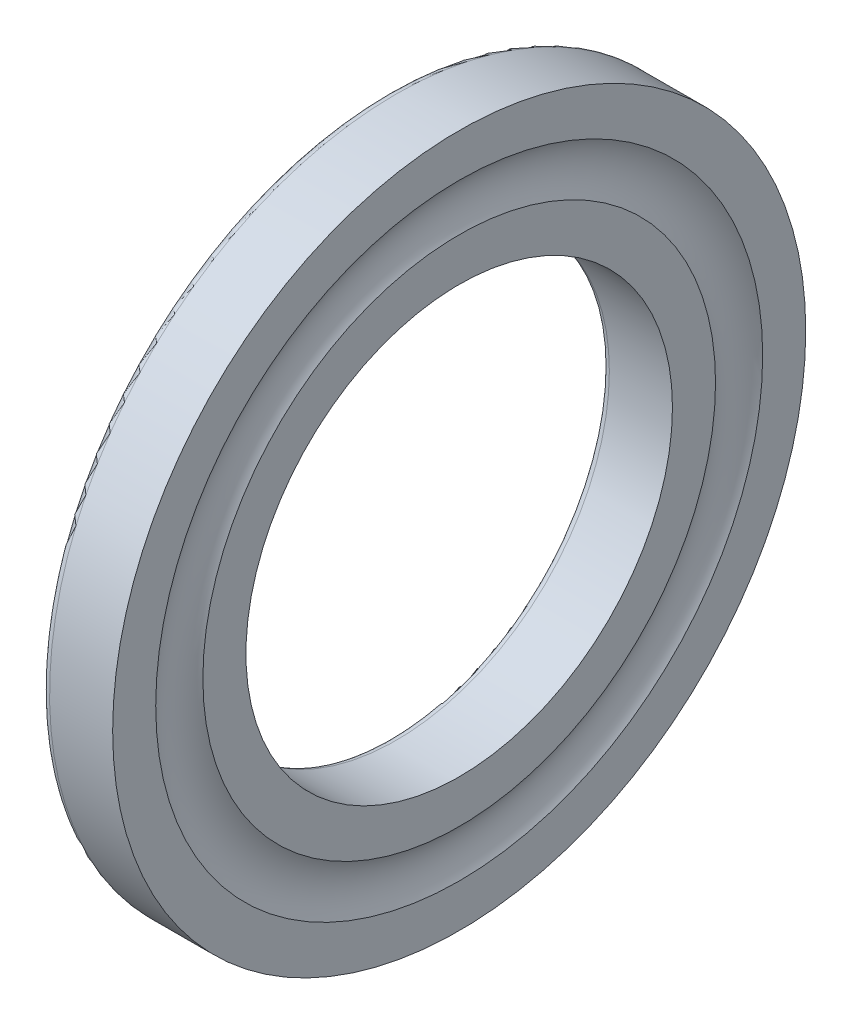
ISO-10303-21;
HEADER;
FILE_DESCRIPTION(('STEP AP214'),'2;1');
FILE_NAME('part.step','',(''),(''),'','','');
FILE_SCHEMA(('AUTOMOTIVE_DESIGN { 1 0 10303 214 1 1 1 1 }'));
ENDSEC;
DATA;
#1=APPLICATION_CONTEXT('core data for automotive mechanical design processes');
#2=APPLICATION_PROTOCOL_DEFINITION('international standard','automotive_design',2000,#1);
#3=PRODUCT_CONTEXT('',#1,'mechanical');
#4=PRODUCT('Part','Part','',(#3));
#5=PRODUCT_RELATED_PRODUCT_CATEGORY('part','',(#4));
#6=PRODUCT_DEFINITION_FORMATION('','',#4);
#7=PRODUCT_DEFINITION_CONTEXT('part definition',#1,'design');
#8=PRODUCT_DEFINITION('design','',#6,#7);
#9=PRODUCT_DEFINITION_SHAPE('','',#8);
#10=(LENGTH_UNIT() NAMED_UNIT(*) SI_UNIT(.MILLI.,.METRE.));
#11=(NAMED_UNIT(*) PLANE_ANGLE_UNIT() SI_UNIT($,.RADIAN.));
#12=(NAMED_UNIT(*) SI_UNIT($,.STERADIAN.) SOLID_ANGLE_UNIT());
#13=UNCERTAINTY_MEASURE_WITH_UNIT(LENGTH_MEASURE(1.E-05),#10,'distance_accuracy_value','');
#14=(GEOMETRIC_REPRESENTATION_CONTEXT(3) GLOBAL_UNCERTAINTY_ASSIGNED_CONTEXT((#13)) GLOBAL_UNIT_ASSIGNED_CONTEXT((#10,
#11,#12)) REPRESENTATION_CONTEXT('',''));
#15=CARTESIAN_POINT('',(0.,0.,0.));
#16=DIRECTION('',(0.,0.,1.));
#17=DIRECTION('',(1.,0.,0.));
#18=AXIS2_PLACEMENT_3D('',#15,#16,#17);
#19=CARTESIAN_POINT('',(8.,0.,0.));
#20=DIRECTION('',(1.,0.,0.));
#21=DIRECTION('',(0.,1.,0.));
#22=AXIS2_PLACEMENT_3D('',#19,#20,#21);
#23=TOROIDAL_SURFACE('',#22,21.,3.2);
#24=CARTESIAN_POINT('',(5.33333333333333,0.,0.));
#25=DIRECTION('',(1.,0.,0.));
#26=DIRECTION('',(0.,0.,-1.));
#27=AXIS2_PLACEMENT_3D('',#24,#25,#26);
#28=CIRCLE('',#27,22.7688665548562);
#29=CARTESIAN_POINT('',(5.33333333333333,0.,-22.7688665548562));
#30=VERTEX_POINT('',#29);
#31=EDGE_CURVE('E18',#30,#30,#28,.F.);
#32=ORIENTED_EDGE('',*,*,#31,.F.);
#33=EDGE_LOOP('',(#32));
#34=FACE_BOUND('',#33,.T.);
#35=CARTESIAN_POINT('',(5.33333333333334,0.,0.));
#36=DIRECTION('',(1.,0.,0.));
#37=DIRECTION('',(0.,0.,-1.));
#38=AXIS2_PLACEMENT_3D('',#35,#36,#37);
#39=CIRCLE('',#38,19.2311334451438);
#40=CARTESIAN_POINT('',(5.33333333333334,0.,-19.2311334451438));
#41=VERTEX_POINT('',#40);
#42=EDGE_CURVE('E52',#41,#41,#39,.T.);
#43=ORIENTED_EDGE('',*,*,#42,.F.);
#44=EDGE_LOOP('',(#43));
#45=FACE_BOUND('',#44,.T.);
#46=ADVANCED_FACE('F14',(#34,#45),#23,.F.);
#47=CARTESIAN_POINT('',(5.33333333333334,0.,21.));
#48=DIRECTION('',(1.,0.,0.));
#49=DIRECTION('',(0.,0.,-1.));
#50=AXIS2_PLACEMENT_3D('',#47,#48,#49);
#51=PLANE('',#50);
#52=CARTESIAN_POINT('',(5.33333333333334,0.,0.));
#53=DIRECTION('',(1.,0.,0.));
#54=DIRECTION('',(0.,0.,-1.));
#55=AXIS2_PLACEMENT_3D('',#52,#53,#54);
#56=CIRCLE('',#55,25.99999999995);
#57=CARTESIAN_POINT('',(5.33333333333334,0.,-25.99999999995));
#58=VERTEX_POINT('',#57);
#59=EDGE_CURVE('E50',#58,#58,#56,.F.);
#60=ORIENTED_EDGE('',*,*,#59,.F.);
#61=EDGE_LOOP('',(#60));
#62=FACE_BOUND('',#61,.T.);
#63=ORIENTED_EDGE('',*,*,#31,.T.);
#64=EDGE_LOOP('',(#63));
#65=FACE_BOUND('',#64,.T.);
#66=ADVANCED_FACE('F59',(#62,#65),#51,.T.);
#67=CARTESIAN_POINT('',(5.33333333333334,0.,21.));
#68=DIRECTION('',(1.,0.,0.));
#69=DIRECTION('',(0.,0.,-1.));
#70=AXIS2_PLACEMENT_3D('',#67,#68,#69);
#71=PLANE('',#70);
#72=CARTESIAN_POINT('',(5.33333333333334,0.,0.));
#73=DIRECTION('',(1.,0.,0.));
#74=DIRECTION('',(0.,0.,-1.));
#75=AXIS2_PLACEMENT_3D('',#72,#73,#74);
#76=CIRCLE('',#75,16.);
#77=CARTESIAN_POINT('',(5.33333333333334,0.,-16.));
#78=VERTEX_POINT('',#77);
#79=EDGE_CURVE('E37',#78,#78,#76,.T.);
#80=ORIENTED_EDGE('',*,*,#79,.F.);
#81=EDGE_LOOP('',(#80));
#82=FACE_BOUND('',#81,.T.);
#83=ORIENTED_EDGE('',*,*,#42,.T.);
#84=EDGE_LOOP('',(#83));
#85=FACE_BOUND('',#84,.T.);
#86=ADVANCED_FACE('F67',(#82,#85),#71,.T.);
#87=CARTESIAN_POINT('',(2.96666666666667,0.,0.));
#88=DIRECTION('',(1.,0.,0.));
#89=DIRECTION('',(0.,0.,-1.));
#90=AXIS2_PLACEMENT_3D('',#87,#88,#89);
#91=CYLINDRICAL_SURFACE('',#90,25.99999999995);
#92=ORIENTED_EDGE('',*,*,#59,.T.);
#93=EDGE_LOOP('',(#92));
#94=FACE_BOUND('',#93,.T.);
#95=CARTESIAN_POINT('',(0.600000000170714,0.,0.));
#96=DIRECTION('',(1.,0.,0.));
#97=DIRECTION('',(0.,1.,0.));
#98=AXIS2_PLACEMENT_3D('',#95,#96,#97);
#99=CIRCLE('',#98,25.9999999999);
#100=CARTESIAN_POINT('',(0.600000000170714,25.9999999999,0.));
#101=VERTEX_POINT('',#100);
#102=EDGE_CURVE('E32',#101,#101,#99,.F.);
#103=ORIENTED_EDGE('',*,*,#102,.F.);
#104=EDGE_LOOP('',(#103));
#105=FACE_BOUND('',#104,.T.);
#106=ADVANCED_FACE('F113',(#94,#105),#91,.T.);
#107=CARTESIAN_POINT('',(0.600000000000003,0.,0.));
#108=DIRECTION('',(1.,0.,0.));
#109=DIRECTION('',(0.,0.,-1.));
#110=AXIS2_PLACEMENT_3D('',#107,#108,#109);
#111=CYLINDRICAL_SURFACE('',#110,16.);
#112=CARTESIAN_POINT('',(0.600000000000003,0.,0.));
#113=DIRECTION('',(1.,0.,0.));
#114=DIRECTION('',(0.,1.,0.));
#115=AXIS2_PLACEMENT_3D('',#112,#113,#114);
#116=CIRCLE('',#115,16.);
#117=CARTESIAN_POINT('',(0.600000000000003,16.,0.));
#118=VERTEX_POINT('',#117);
#119=EDGE_CURVE('E27',#118,#118,#116,.T.);
#120=ORIENTED_EDGE('',*,*,#119,.F.);
#121=EDGE_LOOP('',(#120));
#122=FACE_BOUND('',#121,.T.);
#123=ORIENTED_EDGE('',*,*,#79,.T.);
#124=EDGE_LOOP('',(#123));
#125=FACE_BOUND('',#124,.T.);
#126=ADVANCED_FACE('F109',(#122,#125),#111,.F.);
#127=CARTESIAN_POINT('',(0.600000000170714,0.,0.));
#128=DIRECTION('',(1.,0.,0.));
#129=DIRECTION('',(0.,1.,0.));
#130=AXIS2_PLACEMENT_3D('',#127,#128,#129);
#131=TOROIDAL_SURFACE('',#130,25.3999999997293,0.600000000170713);
#132=CARTESIAN_POINT('',(0.,0.,0.));
#133=DIRECTION('',(1.,0.,0.));
#134=DIRECTION('',(0.,0.,1.));
#135=AXIS2_PLACEMENT_3D('',#132,#133,#134);
#136=CIRCLE('',#135,25.4);
#137=CARTESIAN_POINT('',(0.,0.,25.4));
#138=VERTEX_POINT('',#137);
#139=EDGE_CURVE('E22',#138,#138,#136,.F.);
#140=ORIENTED_EDGE('',*,*,#139,.F.);
#141=EDGE_LOOP('',(#140));
#142=FACE_BOUND('',#141,.T.);
#143=ORIENTED_EDGE('',*,*,#102,.T.);
#144=EDGE_LOOP('',(#143));
#145=FACE_BOUND('',#144,.T.);
#146=ADVANCED_FACE('F76',(#142,#145),#131,.T.);
#147=CARTESIAN_POINT('',(0.600000000270703,0.,0.));
#148=DIRECTION('',(1.,0.,0.));
#149=DIRECTION('',(0.,1.,0.));
#150=AXIS2_PLACEMENT_3D('',#147,#148,#149);
#151=TOROIDAL_SURFACE('',#150,16.6000000001707,0.600000000170705);
#152=ORIENTED_EDGE('',*,*,#119,.T.);
#153=EDGE_LOOP('',(#152));
#154=FACE_BOUND('',#153,.T.);
#155=CARTESIAN_POINT('',(9.99988937142038E-11,0.,0.));
#156=DIRECTION('',(-1.,0.,0.));
#157=DIRECTION('',(0.,0.,1.));
#158=AXIS2_PLACEMENT_3D('',#155,#156,#157);
#159=CIRCLE('',#158,16.6);
#160=CARTESIAN_POINT('',(9.99988937142038E-11,0.,16.6));
#161=VERTEX_POINT('',#160);
#162=EDGE_CURVE('E10',#161,#161,#159,.F.);
#163=ORIENTED_EDGE('',*,*,#162,.F.);
#164=EDGE_LOOP('',(#163));
#165=FACE_BOUND('',#164,.T.);
#166=ADVANCED_FACE('F71',(#154,#165),#151,.T.);
#167=CARTESIAN_POINT('',(5.00016694715555E-11,0.,21.));
#168=DIRECTION('',(-1.,0.,-1.13637886979167E-11));
#169=DIRECTION('',(-1.13637886979167E-11,0.,1.));
#170=AXIS2_PLACEMENT_3D('',#167,#168,#169);
#171=PLANE('',#170);
#172=ORIENTED_EDGE('',*,*,#162,.T.);
#173=EDGE_LOOP('',(#172));
#174=FACE_BOUND('',#173,.T.);
#175=ORIENTED_EDGE('',*,*,#139,.T.);
#176=EDGE_LOOP('',(#175));
#177=FACE_BOUND('',#176,.T.);
#178=ADVANCED_FACE('F69',(#174,#177),#171,.T.);
#179=CLOSED_SHELL('',(#46,#66,#86,#106,#126,#146,#166,#178));
#180=MANIFOLD_SOLID_BREP('B1',#179);
#181=ADVANCED_BREP_SHAPE_REPRESENTATION('',(#18,#180),#14);
#182=SHAPE_DEFINITION_REPRESENTATION(#9,#181);
ENDSEC;
END-ISO-10303-21;
